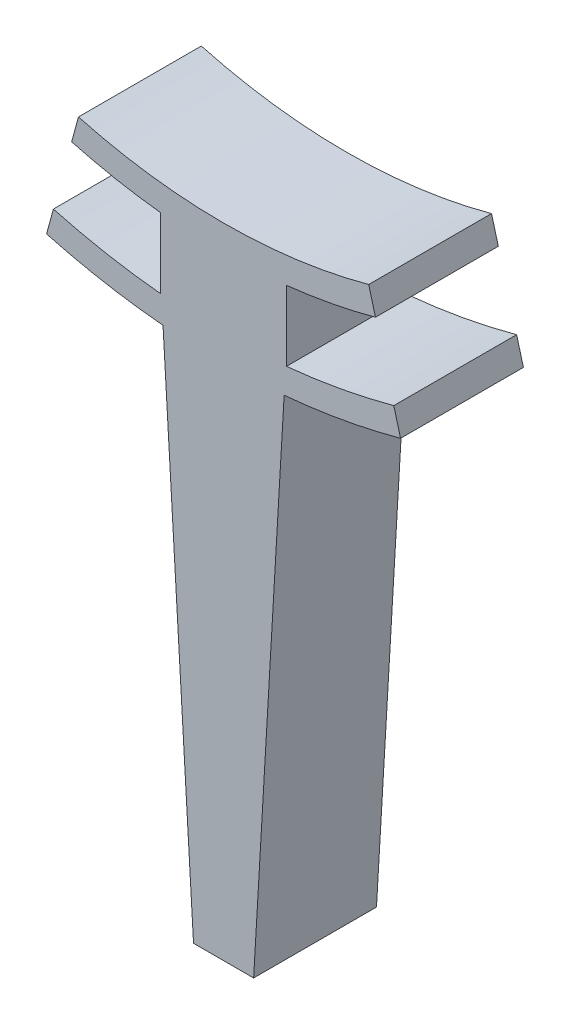
ISO-10303-21;
HEADER;
FILE_DESCRIPTION(('STEP AP214'),'2;1');
FILE_NAME('part.step','',(''),(''),'','','');
FILE_SCHEMA(('AUTOMOTIVE_DESIGN { 1 0 10303 214 1 1 1 1 }'));
ENDSEC;
DATA;
#1=APPLICATION_CONTEXT('core data for automotive mechanical design processes');
#2=APPLICATION_PROTOCOL_DEFINITION('international standard','automotive_design',2000,#1);
#3=PRODUCT_CONTEXT('',#1,'mechanical');
#4=PRODUCT('Part','Part','',(#3));
#5=PRODUCT_RELATED_PRODUCT_CATEGORY('part','',(#4));
#6=PRODUCT_DEFINITION_FORMATION('','',#4);
#7=PRODUCT_DEFINITION_CONTEXT('part definition',#1,'design');
#8=PRODUCT_DEFINITION('design','',#6,#7);
#9=PRODUCT_DEFINITION_SHAPE('','',#8);
#10=(LENGTH_UNIT() NAMED_UNIT(*) SI_UNIT(.MILLI.,.METRE.));
#11=(NAMED_UNIT(*) PLANE_ANGLE_UNIT() SI_UNIT($,.RADIAN.));
#12=(NAMED_UNIT(*) SI_UNIT($,.STERADIAN.) SOLID_ANGLE_UNIT());
#13=UNCERTAINTY_MEASURE_WITH_UNIT(LENGTH_MEASURE(1.E-05),#10,'distance_accuracy_value','');
#14=(GEOMETRIC_REPRESENTATION_CONTEXT(3) GLOBAL_UNCERTAINTY_ASSIGNED_CONTEXT((#13)) GLOBAL_UNIT_ASSIGNED_CONTEXT((#10,
#11,#12)) REPRESENTATION_CONTEXT('',''));
#15=CARTESIAN_POINT('',(0.,0.,0.));
#16=DIRECTION('',(0.,0.,1.));
#17=DIRECTION('',(1.,0.,0.));
#18=AXIS2_PLACEMENT_3D('',#15,#16,#17);
#19=CARTESIAN_POINT('',(-0.300000000011735,16.8600000000012,-9.5));
#20=DIRECTION('',(0.,0.,1.));
#21=DIRECTION('',(1.,0.,0.));
#22=AXIS2_PLACEMENT_3D('',#19,#20,#21);
#23=CYLINDRICAL_SURFACE('',#22,50.2000000000121);
#24=CARTESIAN_POINT('',(-0.300000000011735,16.8600000000012,0.));
#25=DIRECTION('',(0.,0.,1.));
#26=DIRECTION('',(1.,0.,0.));
#27=AXIS2_PLACEMENT_3D('',#24,#25,#26);
#28=CIRCLE('',#27,50.2000000000121);
#29=CARTESIAN_POINT('',(-13.4635226209664,-31.5833862586908,0.));
#30=VERTEX_POINT('',#29);
#31=CARTESIAN_POINT('',(-5.16515575527619,-33.1036894101918,0.));
#32=VERTEX_POINT('',#31);
#33=EDGE_CURVE('E181',#30,#32,#28,.T.);
#34=ORIENTED_EDGE('',*,*,#33,.T.);
#35=DIRECTION('',(0.,0.,1.));
#36=VECTOR('',#35,1.);
#37=CARTESIAN_POINT('',(-5.16515575527619,-33.1036894101918,-9.5));
#38=LINE('',#37,#36);
#39=CARTESIAN_POINT('',(-5.16515575527619,-33.1036894101918,-9.5));
#40=VERTEX_POINT('',#39);
#41=EDGE_CURVE('E11',#40,#32,#38,.T.);
#42=ORIENTED_EDGE('',*,*,#41,.F.);
#43=CARTESIAN_POINT('',(-0.300000000011735,16.8600000000012,-9.5));
#44=DIRECTION('',(0.,0.,1.));
#45=DIRECTION('',(1.,0.,0.));
#46=AXIS2_PLACEMENT_3D('',#43,#44,#45);
#47=CIRCLE('',#46,50.2000000000121);
#48=CARTESIAN_POINT('',(-13.4635226209664,-31.5833862586908,-9.5));
#49=VERTEX_POINT('',#48);
#50=EDGE_CURVE('E118',#49,#40,#47,.T.);
#51=ORIENTED_EDGE('',*,*,#50,.F.);
#52=DIRECTION('',(0.,0.,1.));
#53=VECTOR('',#52,1.);
#54=CARTESIAN_POINT('',(-13.4635226209664,-31.5833862586908,-9.5));
#55=LINE('',#54,#53);
#56=EDGE_CURVE('E54',#49,#30,#55,.T.);
#57=ORIENTED_EDGE('',*,*,#56,.T.);
#58=EDGE_LOOP('',(#34,#42,#51,#57));
#59=FACE_BOUND('',#58,.T.);
#60=ADVANCED_FACE('F39',(#59),#23,.F.);
#61=CARTESIAN_POINT('',(-5.16515575527619,-27.6750452955403,-9.5));
#62=DIRECTION('',(-1.,0.,0.));
#63=DIRECTION('',(0.,0.,1.));
#64=AXIS2_PLACEMENT_3D('',#61,#62,#63);
#65=PLANE('',#64);
#66=DIRECTION('',(0.,-1.,0.));
#67=VECTOR('',#66,1.);
#68=CARTESIAN_POINT('',(-5.16515575527619,-27.6750452955403,0.));
#69=LINE('',#68,#67);
#70=CARTESIAN_POINT('',(-5.16515575527621,-27.6750452955403,0.));
#71=VERTEX_POINT('',#70);
#72=EDGE_CURVE('E183',#71,#32,#69,.T.);
#73=ORIENTED_EDGE('',*,*,#72,.F.);
#74=DIRECTION('',(0.,0.,1.));
#75=VECTOR('',#74,1.);
#76=CARTESIAN_POINT('',(-5.16515575527621,-27.6750452955403,-9.5));
#77=LINE('',#76,#75);
#78=CARTESIAN_POINT('',(-5.16515575527621,-27.6750452955403,-9.5));
#79=VERTEX_POINT('',#78);
#80=EDGE_CURVE('E50',#79,#71,#77,.T.);
#81=ORIENTED_EDGE('',*,*,#80,.F.);
#82=DIRECTION('',(0.,-1.,0.));
#83=VECTOR('',#82,1.);
#84=CARTESIAN_POINT('',(-5.16515575527619,-27.6750452955403,-9.5));
#85=LINE('',#84,#83);
#86=EDGE_CURVE('E311',#79,#40,#85,.T.);
#87=ORIENTED_EDGE('',*,*,#86,.T.);
#88=ORIENTED_EDGE('',*,*,#41,.T.);
#89=EDGE_LOOP('',(#73,#81,#87,#88));
#90=FACE_BOUND('',#89,.T.);
#91=ADVANCED_FACE('F258',(#90),#65,.T.);
#92=CARTESIAN_POINT('',(-0.300000000011735,16.8600000000012,-9.5));
#93=DIRECTION('',(0.,0.,1.));
#94=DIRECTION('',(1.,0.,0.));
#95=AXIS2_PLACEMENT_3D('',#92,#93,#94);
#96=CYLINDRICAL_SURFACE('',#95,44.7999999999879);
#97=CARTESIAN_POINT('',(-0.300000000011735,16.8600000000012,0.));
#98=DIRECTION('',(0.,0.,1.));
#99=DIRECTION('',(1.,0.,0.));
#100=AXIS2_PLACEMENT_3D('',#97,#98,#99);
#101=CIRCLE('',#100,44.7999999999879);
#102=CARTESIAN_POINT('',(-12.0475261637263,-26.3723447089289,0.));
#103=VERTEX_POINT('',#102);
#104=EDGE_CURVE('E186',#103,#71,#101,.T.);
#105=ORIENTED_EDGE('',*,*,#104,.F.);
#106=DIRECTION('',(0.,0.,1.));
#107=VECTOR('',#106,1.);
#108=CARTESIAN_POINT('',(-12.0475261637263,-26.3723447089289,-9.5));
#109=LINE('',#108,#107);
#110=CARTESIAN_POINT('',(-12.0475261637263,-26.3723447089289,-9.5));
#111=VERTEX_POINT('',#110);
#112=EDGE_CURVE('E247',#111,#103,#109,.T.);
#113=ORIENTED_EDGE('',*,*,#112,.F.);
#114=CARTESIAN_POINT('',(-0.300000000011735,16.8600000000012,-9.5));
#115=DIRECTION('',(0.,0.,1.));
#116=DIRECTION('',(1.,0.,0.));
#117=AXIS2_PLACEMENT_3D('',#114,#115,#116);
#118=CIRCLE('',#117,44.7999999999879);
#119=EDGE_CURVE('E251',#111,#79,#118,.T.);
#120=ORIENTED_EDGE('',*,*,#119,.T.);
#121=ORIENTED_EDGE('',*,*,#80,.T.);
#122=EDGE_LOOP('',(#105,#113,#120,#121));
#123=FACE_BOUND('',#122,.T.);
#124=ADVANCED_FACE('F253',(#123),#96,.T.);
#125=CARTESIAN_POINT('',(-12.0475261637263,-26.3723447089289,-9.5));
#126=DIRECTION('',(0.965007694396022,-0.262221566154413,0.));
#127=DIRECTION('',(0.262221566154413,0.965007694396022,0.));
#128=AXIS2_PLACEMENT_3D('',#125,#126,#127);
#129=PLANE('',#128);
#130=DIRECTION('',(0.262221566154413,0.965007694396022,0.));
#131=VECTOR('',#130,1.);
#132=CARTESIAN_POINT('',(-12.0475261637263,-26.3723447089289,0.));
#133=LINE('',#132,#131);
#134=CARTESIAN_POINT('',(-11.5230830314174,-24.4423293201369,0.));
#135=VERTEX_POINT('',#134);
#136=EDGE_CURVE('E188',#103,#135,#133,.T.);
#137=ORIENTED_EDGE('',*,*,#136,.T.);
#138=DIRECTION('',(0.,0.,1.));
#139=VECTOR('',#138,1.);
#140=CARTESIAN_POINT('',(-11.5230830314174,-24.4423293201369,-9.5));
#141=LINE('',#140,#139);
#142=CARTESIAN_POINT('',(-11.5230830314174,-24.4423293201369,-9.5));
#143=VERTEX_POINT('',#142);
#144=EDGE_CURVE('E241',#143,#135,#141,.T.);
#145=ORIENTED_EDGE('',*,*,#144,.F.);
#146=DIRECTION('',(0.262221566154413,0.965007694396022,0.));
#147=VECTOR('',#146,1.);
#148=CARTESIAN_POINT('',(-12.0475261637263,-26.3723447089289,-9.5));
#149=LINE('',#148,#147);
#150=EDGE_CURVE('E273',#111,#143,#149,.T.);
#151=ORIENTED_EDGE('',*,*,#150,.F.);
#152=ORIENTED_EDGE('',*,*,#112,.T.);
#153=EDGE_LOOP('',(#137,#145,#151,#152));
#154=FACE_BOUND('',#153,.T.);
#155=ADVANCED_FACE('F261',(#154),#129,.F.);
#156=CARTESIAN_POINT('',(-0.300000000011735,16.8600000000012,-9.5));
#157=DIRECTION('',(0.,0.,1.));
#158=DIRECTION('',(1.,0.,0.));
#159=AXIS2_PLACEMENT_3D('',#156,#157,#158);
#160=CYLINDRICAL_SURFACE('',#159,42.7999999999879);
#161=CARTESIAN_POINT('',(-0.300000000011735,16.8600000000012,0.));
#162=DIRECTION('',(0.,0.,1.));
#163=DIRECTION('',(1.,0.,0.));
#164=AXIS2_PLACEMENT_3D('',#161,#162,#163);
#165=CIRCLE('',#164,42.7999999999879);
#166=CARTESIAN_POINT('',(10.923083031394,-24.4423293201368,0.));
#167=VERTEX_POINT('',#166);
#168=EDGE_CURVE('E192',#135,#167,#165,.T.);
#169=ORIENTED_EDGE('',*,*,#168,.T.);
#170=DIRECTION('',(0.,0.,1.));
#171=VECTOR('',#170,1.);
#172=CARTESIAN_POINT('',(10.923083031394,-24.4423293201368,-9.5));
#173=LINE('',#172,#171);
#174=CARTESIAN_POINT('',(10.923083031394,-24.4423293201368,-9.5));
#175=VERTEX_POINT('',#174);
#176=EDGE_CURVE('E243',#175,#167,#173,.T.);
#177=ORIENTED_EDGE('',*,*,#176,.F.);
#178=CARTESIAN_POINT('',(-0.300000000011735,16.8600000000012,-9.5));
#179=DIRECTION('',(0.,0.,1.));
#180=DIRECTION('',(1.,0.,0.));
#181=AXIS2_PLACEMENT_3D('',#178,#179,#180);
#182=CIRCLE('',#181,42.7999999999879);
#183=EDGE_CURVE('E267',#143,#175,#182,.T.);
#184=ORIENTED_EDGE('',*,*,#183,.F.);
#185=ORIENTED_EDGE('',*,*,#144,.T.);
#186=EDGE_LOOP('',(#169,#177,#184,#185));
#187=FACE_BOUND('',#186,.T.);
#188=ADVANCED_FACE('F270',(#187),#160,.F.);
#189=CARTESIAN_POINT('',(11.4475261637028,-26.3723447089289,-9.5));
#190=DIRECTION('',(0.965007694396022,0.262221566154413,0.));
#191=DIRECTION('',(-0.262221566154413,0.965007694396022,0.));
#192=AXIS2_PLACEMENT_3D('',#189,#190,#191);
#193=PLANE('',#192);
#194=DIRECTION('',(-0.262221566154413,0.965007694396022,0.));
#195=VECTOR('',#194,1.);
#196=CARTESIAN_POINT('',(11.4475261637028,-26.3723447089289,0.));
#197=LINE('',#196,#195);
#198=CARTESIAN_POINT('',(11.4475261637028,-26.3723447089289,0.));
#199=VERTEX_POINT('',#198);
#200=EDGE_CURVE('E191',#199,#167,#197,.T.);
#201=ORIENTED_EDGE('',*,*,#200,.F.);
#202=DIRECTION('',(0.,0.,1.));
#203=VECTOR('',#202,1.);
#204=CARTESIAN_POINT('',(11.4475261637028,-26.3723447089289,-9.5));
#205=LINE('',#204,#203);
#206=CARTESIAN_POINT('',(11.4475261637028,-26.3723447089289,-9.5));
#207=VERTEX_POINT('',#206);
#208=EDGE_CURVE('E236',#207,#199,#205,.T.);
#209=ORIENTED_EDGE('',*,*,#208,.F.);
#210=DIRECTION('',(-0.262221566154413,0.965007694396022,0.));
#211=VECTOR('',#210,1.);
#212=CARTESIAN_POINT('',(11.4475261637028,-26.3723447089289,-9.5));
#213=LINE('',#212,#211);
#214=EDGE_CURVE('E275',#207,#175,#213,.T.);
#215=ORIENTED_EDGE('',*,*,#214,.T.);
#216=ORIENTED_EDGE('',*,*,#176,.T.);
#217=EDGE_LOOP('',(#201,#209,#215,#216));
#218=FACE_BOUND('',#217,.T.);
#219=ADVANCED_FACE('F322',(#218),#193,.T.);
#220=CARTESIAN_POINT('',(-0.300000000011735,16.8600000000012,-9.5));
#221=DIRECTION('',(0.,0.,1.));
#222=DIRECTION('',(1.,0.,0.));
#223=AXIS2_PLACEMENT_3D('',#220,#221,#222);
#224=CYLINDRICAL_SURFACE('',#223,44.7999999999879);
#225=CARTESIAN_POINT('',(-0.300000000011735,16.8600000000012,0.));
#226=DIRECTION('',(0.,0.,1.));
#227=DIRECTION('',(1.,0.,0.));
#228=AXIS2_PLACEMENT_3D('',#225,#226,#227);
#229=CIRCLE('',#228,44.7999999999879);
#230=CARTESIAN_POINT('',(4.56515575525271,-27.6750452955403,0.));
#231=VERTEX_POINT('',#230);
#232=EDGE_CURVE('E200',#231,#199,#229,.T.);
#233=ORIENTED_EDGE('',*,*,#232,.F.);
#234=DIRECTION('',(0.,0.,1.));
#235=VECTOR('',#234,1.);
#236=CARTESIAN_POINT('',(4.56515575525271,-27.6750452955403,-9.5));
#237=LINE('',#236,#235);
#238=CARTESIAN_POINT('',(4.56515575525271,-27.6750452955403,-9.5));
#239=VERTEX_POINT('',#238);
#240=EDGE_CURVE('E240',#239,#231,#237,.T.);
#241=ORIENTED_EDGE('',*,*,#240,.F.);
#242=CARTESIAN_POINT('',(-0.300000000011735,16.8600000000012,-9.5));
#243=DIRECTION('',(0.,0.,1.));
#244=DIRECTION('',(1.,0.,0.));
#245=AXIS2_PLACEMENT_3D('',#242,#243,#244);
#246=CIRCLE('',#245,44.7999999999879);
#247=EDGE_CURVE('E274',#239,#207,#246,.T.);
#248=ORIENTED_EDGE('',*,*,#247,.T.);
#249=ORIENTED_EDGE('',*,*,#208,.T.);
#250=EDGE_LOOP('',(#233,#241,#248,#249));
#251=FACE_BOUND('',#250,.T.);
#252=ADVANCED_FACE('F327',(#251),#224,.T.);
#253=CARTESIAN_POINT('',(4.56515575525271,-27.6750452955403,-9.5));
#254=DIRECTION('',(-1.,0.,0.));
#255=DIRECTION('',(0.,-1.,0.));
#256=AXIS2_PLACEMENT_3D('',#253,#254,#255);
#257=PLANE('',#256);
#258=DIRECTION('',(0.,-1.,0.));
#259=VECTOR('',#258,1.);
#260=CARTESIAN_POINT('',(4.56515575525271,-27.6750452955403,0.));
#261=LINE('',#260,#259);
#262=CARTESIAN_POINT('',(4.56515575525269,-33.1036894101918,0.));
#263=VERTEX_POINT('',#262);
#264=EDGE_CURVE('E199',#231,#263,#261,.T.);
#265=ORIENTED_EDGE('',*,*,#264,.T.);
#266=DIRECTION('',(0.,0.,1.));
#267=VECTOR('',#266,1.);
#268=CARTESIAN_POINT('',(4.56515575525269,-33.1036894101918,-9.5));
#269=LINE('',#268,#267);
#270=CARTESIAN_POINT('',(4.56515575525269,-33.1036894101918,-9.5));
#271=VERTEX_POINT('',#270);
#272=EDGE_CURVE('E233',#271,#263,#269,.T.);
#273=ORIENTED_EDGE('',*,*,#272,.F.);
#274=DIRECTION('',(0.,-1.,0.));
#275=VECTOR('',#274,1.);
#276=CARTESIAN_POINT('',(4.56515575525271,-27.6750452955403,-9.5));
#277=LINE('',#276,#275);
#278=EDGE_CURVE('E285',#239,#271,#277,.T.);
#279=ORIENTED_EDGE('',*,*,#278,.F.);
#280=ORIENTED_EDGE('',*,*,#240,.T.);
#281=EDGE_LOOP('',(#265,#273,#279,#280));
#282=FACE_BOUND('',#281,.T.);
#283=ADVANCED_FACE('F328',(#282),#257,.F.);
#284=CARTESIAN_POINT('',(-0.300000000011735,16.8600000000012,-9.5));
#285=DIRECTION('',(0.,0.,1.));
#286=DIRECTION('',(1.,0.,0.));
#287=AXIS2_PLACEMENT_3D('',#284,#285,#286);
#288=CYLINDRICAL_SURFACE('',#287,50.2000000000121);
#289=CARTESIAN_POINT('',(-0.300000000011735,16.8600000000012,0.));
#290=DIRECTION('',(0.,0.,1.));
#291=DIRECTION('',(1.,0.,0.));
#292=AXIS2_PLACEMENT_3D('',#289,#290,#291);
#293=CIRCLE('',#292,50.2000000000121);
#294=CARTESIAN_POINT('',(12.863522620943,-31.5833862586908,0.));
#295=VERTEX_POINT('',#294);
#296=EDGE_CURVE('E205',#263,#295,#293,.T.);
#297=ORIENTED_EDGE('',*,*,#296,.T.);
#298=DIRECTION('',(0.,0.,1.));
#299=VECTOR('',#298,1.);
#300=CARTESIAN_POINT('',(12.863522620943,-31.5833862586908,-9.5));
#301=LINE('',#300,#299);
#302=CARTESIAN_POINT('',(12.863522620943,-31.5833862586908,-9.5));
#303=VERTEX_POINT('',#302);
#304=EDGE_CURVE('E231',#303,#295,#301,.T.);
#305=ORIENTED_EDGE('',*,*,#304,.F.);
#306=CARTESIAN_POINT('',(-0.300000000011735,16.8600000000012,-9.5));
#307=DIRECTION('',(0.,0.,1.));
#308=DIRECTION('',(1.,0.,0.));
#309=AXIS2_PLACEMENT_3D('',#306,#307,#308);
#310=CIRCLE('',#309,50.2000000000121);
#311=EDGE_CURVE('E281',#271,#303,#310,.T.);
#312=ORIENTED_EDGE('',*,*,#311,.F.);
#313=ORIENTED_EDGE('',*,*,#272,.T.);
#314=EDGE_LOOP('',(#297,#305,#312,#313));
#315=FACE_BOUND('',#314,.T.);
#316=ADVANCED_FACE('F332',(#315),#288,.F.);
#317=CARTESIAN_POINT('',(12.863522620943,-31.5833862586908,-9.5));
#318=DIRECTION('',(-0.965007694396022,-0.262221566154413,0.));
#319=DIRECTION('',(0.262221566154413,-0.965007694396022,0.));
#320=AXIS2_PLACEMENT_3D('',#317,#318,#319);
#321=PLANE('',#320);
#322=DIRECTION('',(0.262221566154413,-0.965007694396022,0.));
#323=VECTOR('',#322,1.);
#324=CARTESIAN_POINT('',(12.863522620943,-31.5833862586908,0.));
#325=LINE('',#324,#323);
#326=CARTESIAN_POINT('',(13.3879657532518,-33.5134016474829,0.));
#327=VERTEX_POINT('',#326);
#328=EDGE_CURVE('E204',#295,#327,#325,.T.);
#329=ORIENTED_EDGE('',*,*,#328,.T.);
#330=DIRECTION('',(0.,0.,1.));
#331=VECTOR('',#330,1.);
#332=CARTESIAN_POINT('',(13.3879657532518,-33.5134016474829,-9.5));
#333=LINE('',#332,#331);
#334=CARTESIAN_POINT('',(13.3879657532518,-33.5134016474829,-9.5));
#335=VERTEX_POINT('',#334);
#336=EDGE_CURVE('E227',#335,#327,#333,.T.);
#337=ORIENTED_EDGE('',*,*,#336,.F.);
#338=DIRECTION('',(0.262221566154413,-0.965007694396022,0.));
#339=VECTOR('',#338,1.);
#340=CARTESIAN_POINT('',(12.863522620943,-31.5833862586908,-9.5));
#341=LINE('',#340,#339);
#342=EDGE_CURVE('E288',#303,#335,#341,.T.);
#343=ORIENTED_EDGE('',*,*,#342,.F.);
#344=ORIENTED_EDGE('',*,*,#304,.T.);
#345=EDGE_LOOP('',(#329,#337,#343,#344));
#346=FACE_BOUND('',#345,.T.);
#347=ADVANCED_FACE('F336',(#346),#321,.F.);
#348=CARTESIAN_POINT('',(-0.300000000011735,16.8600000000012,-9.5));
#349=DIRECTION('',(0.,0.,1.));
#350=DIRECTION('',(1.,0.,0.));
#351=AXIS2_PLACEMENT_3D('',#348,#349,#350);
#352=CYLINDRICAL_SURFACE('',#351,52.2000000000121);
#353=CARTESIAN_POINT('',(-0.300000000011735,16.8600000000012,0.));
#354=DIRECTION('',(0.,0.,1.));
#355=DIRECTION('',(1.,0.,0.));
#356=AXIS2_PLACEMENT_3D('',#353,#354,#355);
#357=CIRCLE('',#356,52.2000000000121);
#358=CARTESIAN_POINT('',(4.38362530936764,-35.12945714241,0.));
#359=VERTEX_POINT('',#358);
#360=EDGE_CURVE('E210',#359,#327,#357,.T.);
#361=ORIENTED_EDGE('',*,*,#360,.F.);
#362=DIRECTION('',(0.,0.,1.));
#363=VECTOR('',#362,1.);
#364=CARTESIAN_POINT('',(4.38362530936764,-35.12945714241,-9.5));
#365=LINE('',#364,#363);
#366=CARTESIAN_POINT('',(4.38362530936764,-35.12945714241,-9.5));
#367=VERTEX_POINT('',#366);
#368=EDGE_CURVE('E230',#367,#359,#365,.T.);
#369=ORIENTED_EDGE('',*,*,#368,.F.);
#370=CARTESIAN_POINT('',(-0.300000000011735,16.8600000000012,-9.5));
#371=DIRECTION('',(0.,0.,1.));
#372=DIRECTION('',(1.,0.,0.));
#373=AXIS2_PLACEMENT_3D('',#370,#371,#372);
#374=CIRCLE('',#373,52.2000000000121);
#375=EDGE_CURVE('E286',#367,#335,#374,.T.);
#376=ORIENTED_EDGE('',*,*,#375,.T.);
#377=ORIENTED_EDGE('',*,*,#336,.T.);
#378=EDGE_LOOP('',(#361,#369,#376,#377));
#379=FACE_BOUND('',#378,.T.);
#380=ADVANCED_FACE('F345',(#379),#352,.T.);
#381=CARTESIAN_POINT('',(4.38362530936764,-35.12945714241,-9.5));
#382=DIRECTION('',(-0.998283261595363,0.0585707232200894,0.));
#383=DIRECTION('',(-0.0585707232200894,-0.998283261595363,0.));
#384=AXIS2_PLACEMENT_3D('',#381,#382,#383);
#385=PLANE('',#384);
#386=DIRECTION('',(-0.0585707232200894,-0.998283261595363,0.));
#387=VECTOR('',#386,1.);
#388=CARTESIAN_POINT('',(4.38362530936764,-35.12945714241,0.));
#389=LINE('',#388,#387);
#390=CARTESIAN_POINT('',(2.02441458547121,-75.3400000000109,0.));
#391=VERTEX_POINT('',#390);
#392=EDGE_CURVE('E209',#359,#391,#389,.T.);
#393=ORIENTED_EDGE('',*,*,#392,.T.);
#394=DIRECTION('',(0.,0.,1.));
#395=VECTOR('',#394,1.);
#396=CARTESIAN_POINT('',(2.02441458547121,-75.3400000000109,-9.5));
#397=LINE('',#396,#395);
#398=CARTESIAN_POINT('',(2.02441458547121,-75.3400000000109,-9.5));
#399=VERTEX_POINT('',#398);
#400=EDGE_CURVE('E224',#399,#391,#397,.T.);
#401=ORIENTED_EDGE('',*,*,#400,.F.);
#402=DIRECTION('',(-0.0585707232200894,-0.998283261595363,0.));
#403=VECTOR('',#402,1.);
#404=CARTESIAN_POINT('',(4.38362530936764,-35.12945714241,-9.5));
#405=LINE('',#404,#403);
#406=EDGE_CURVE('E292',#367,#399,#405,.T.);
#407=ORIENTED_EDGE('',*,*,#406,.F.);
#408=ORIENTED_EDGE('',*,*,#368,.T.);
#409=EDGE_LOOP('',(#393,#401,#407,#408));
#410=FACE_BOUND('',#409,.T.);
#411=ADVANCED_FACE('F348',(#410),#385,.F.);
#412=CARTESIAN_POINT('',(-2.62441458549467,-75.3400000000109,-9.5));
#413=DIRECTION('',(0.,-1.,0.));
#414=DIRECTION('',(0.,0.,-1.));
#415=AXIS2_PLACEMENT_3D('',#412,#413,#414);
#416=PLANE('',#415);
#417=DIRECTION('',(1.,0.,0.));
#418=VECTOR('',#417,1.);
#419=CARTESIAN_POINT('',(-2.62441458549467,-75.3400000000109,0.));
#420=LINE('',#419,#418);
#421=CARTESIAN_POINT('',(-2.62441458549467,-75.3400000000109,0.));
#422=VERTEX_POINT('',#421);
#423=EDGE_CURVE('E211',#422,#391,#420,.T.);
#424=ORIENTED_EDGE('',*,*,#423,.F.);
#425=DIRECTION('',(0.,0.,1.));
#426=VECTOR('',#425,1.);
#427=CARTESIAN_POINT('',(-2.62441458549467,-75.3400000000109,-9.5));
#428=LINE('',#427,#426);
#429=CARTESIAN_POINT('',(-2.62441458549467,-75.3400000000109,-9.5));
#430=VERTEX_POINT('',#429);
#431=EDGE_CURVE('E168',#430,#422,#428,.T.);
#432=ORIENTED_EDGE('',*,*,#431,.F.);
#433=DIRECTION('',(1.,0.,0.));
#434=VECTOR('',#433,1.);
#435=CARTESIAN_POINT('',(-2.62441458549467,-75.3400000000109,-9.5));
#436=LINE('',#435,#434);
#437=EDGE_CURVE('E171',#430,#399,#436,.T.);
#438=ORIENTED_EDGE('',*,*,#437,.T.);
#439=ORIENTED_EDGE('',*,*,#400,.T.);
#440=EDGE_LOOP('',(#424,#432,#438,#439));
#441=FACE_BOUND('',#440,.T.);
#442=ADVANCED_FACE('F294',(#441),#416,.T.);
#443=CARTESIAN_POINT('',(-4.98362530939111,-35.12945714241,-9.5));
#444=DIRECTION('',(-0.998283261595363,-0.0585707232200896,0.));
#445=DIRECTION('',(0.0585707232200896,-0.998283261595363,0.));
#446=AXIS2_PLACEMENT_3D('',#443,#444,#445);
#447=PLANE('',#446);
#448=DIRECTION('',(0.0585707232200896,-0.998283261595363,0.));
#449=VECTOR('',#448,1.);
#450=CARTESIAN_POINT('',(-4.98362530939111,-35.12945714241,0.));
#451=LINE('',#450,#449);
#452=CARTESIAN_POINT('',(-4.98362530939115,-35.12945714241,0.));
#453=VERTEX_POINT('',#452);
#454=EDGE_CURVE('E165',#453,#422,#451,.T.);
#455=ORIENTED_EDGE('',*,*,#454,.F.);
#456=DIRECTION('',(0.,0.,1.));
#457=VECTOR('',#456,1.);
#458=CARTESIAN_POINT('',(-4.98362530939115,-35.12945714241,-9.5));
#459=LINE('',#458,#457);
#460=CARTESIAN_POINT('',(-4.98362530939115,-35.12945714241,-9.5));
#461=VERTEX_POINT('',#460);
#462=EDGE_CURVE('E160',#461,#453,#459,.T.);
#463=ORIENTED_EDGE('',*,*,#462,.F.);
#464=DIRECTION('',(0.0585707232200896,-0.998283261595363,0.));
#465=VECTOR('',#464,1.);
#466=CARTESIAN_POINT('',(-4.98362530939111,-35.12945714241,-9.5));
#467=LINE('',#466,#465);
#468=EDGE_CURVE('E158',#461,#430,#467,.T.);
#469=ORIENTED_EDGE('',*,*,#468,.T.);
#470=ORIENTED_EDGE('',*,*,#431,.T.);
#471=EDGE_LOOP('',(#455,#463,#469,#470));
#472=FACE_BOUND('',#471,.T.);
#473=ADVANCED_FACE('F159',(#472),#447,.T.);
#474=CARTESIAN_POINT('',(-0.300000000011735,16.8600000000012,-9.5));
#475=DIRECTION('',(0.,0.,1.));
#476=DIRECTION('',(1.,0.,0.));
#477=AXIS2_PLACEMENT_3D('',#474,#475,#476);
#478=CYLINDRICAL_SURFACE('',#477,52.2000000000121);
#479=CARTESIAN_POINT('',(-0.300000000011735,16.8600000000012,0.));
#480=DIRECTION('',(0.,0.,1.));
#481=DIRECTION('',(1.,0.,0.));
#482=AXIS2_PLACEMENT_3D('',#479,#480,#481);
#483=CIRCLE('',#482,52.2000000000121);
#484=CARTESIAN_POINT('',(-13.9879657532753,-33.5134016474829,0.));
#485=VERTEX_POINT('',#484);
#486=EDGE_CURVE('E220',#485,#453,#483,.T.);
#487=ORIENTED_EDGE('',*,*,#486,.F.);
#488=DIRECTION('',(0.,0.,1.));
#489=VECTOR('',#488,1.);
#490=CARTESIAN_POINT('',(-13.9879657532753,-33.5134016474829,-9.5));
#491=LINE('',#490,#489);
#492=CARTESIAN_POINT('',(-13.9879657532753,-33.5134016474829,-9.5));
#493=VERTEX_POINT('',#492);
#494=EDGE_CURVE('E101',#493,#485,#491,.T.);
#495=ORIENTED_EDGE('',*,*,#494,.F.);
#496=CARTESIAN_POINT('',(-0.300000000011735,16.8600000000012,-9.5));
#497=DIRECTION('',(0.,0.,1.));
#498=DIRECTION('',(1.,0.,0.));
#499=AXIS2_PLACEMENT_3D('',#496,#497,#498);
#500=CIRCLE('',#499,52.2000000000121);
#501=EDGE_CURVE('E173',#493,#461,#500,.T.);
#502=ORIENTED_EDGE('',*,*,#501,.T.);
#503=ORIENTED_EDGE('',*,*,#462,.T.);
#504=EDGE_LOOP('',(#487,#495,#502,#503));
#505=FACE_BOUND('',#504,.T.);
#506=ADVANCED_FACE('F172',(#505),#478,.T.);
#507=CARTESIAN_POINT('',(-13.4635226209664,-31.5833862586908,-9.5));
#508=DIRECTION('',(-0.965007694396022,0.262221566154413,0.));
#509=DIRECTION('',(-0.262221566154413,-0.965007694396022,0.));
#510=AXIS2_PLACEMENT_3D('',#507,#508,#509);
#511=PLANE('',#510);
#512=DIRECTION('',(-0.262221566154413,-0.965007694396022,0.));
#513=VECTOR('',#512,1.);
#514=CARTESIAN_POINT('',(-13.4635226209664,-31.5833862586908,0.));
#515=LINE('',#514,#513);
#516=EDGE_CURVE('E219',#30,#485,#515,.T.);
#517=ORIENTED_EDGE('',*,*,#516,.F.);
#518=ORIENTED_EDGE('',*,*,#56,.F.);
#519=DIRECTION('',(-0.262221566154413,-0.965007694396022,0.));
#520=VECTOR('',#519,1.);
#521=CARTESIAN_POINT('',(-13.4635226209664,-31.5833862586908,-9.5));
#522=LINE('',#521,#520);
#523=EDGE_CURVE('E176',#49,#493,#522,.T.);
#524=ORIENTED_EDGE('',*,*,#523,.T.);
#525=ORIENTED_EDGE('',*,*,#494,.T.);
#526=EDGE_LOOP('',(#517,#518,#524,#525));
#527=FACE_BOUND('',#526,.T.);
#528=ADVANCED_FACE('F300',(#527),#511,.T.);
#529=CARTESIAN_POINT('',(-0.300000000011735,16.8600000000012,-9.5));
#530=DIRECTION('',(0.,0.,1.));
#531=DIRECTION('',(1.,0.,0.));
#532=AXIS2_PLACEMENT_3D('',#529,#530,#531);
#533=PLANE('',#532);
#534=ORIENTED_EDGE('',*,*,#50,.T.);
#535=ORIENTED_EDGE('',*,*,#86,.F.);
#536=ORIENTED_EDGE('',*,*,#119,.F.);
#537=ORIENTED_EDGE('',*,*,#150,.T.);
#538=ORIENTED_EDGE('',*,*,#183,.T.);
#539=ORIENTED_EDGE('',*,*,#214,.F.);
#540=ORIENTED_EDGE('',*,*,#247,.F.);
#541=ORIENTED_EDGE('',*,*,#278,.T.);
#542=ORIENTED_EDGE('',*,*,#311,.T.);
#543=ORIENTED_EDGE('',*,*,#342,.T.);
#544=ORIENTED_EDGE('',*,*,#375,.F.);
#545=ORIENTED_EDGE('',*,*,#406,.T.);
#546=ORIENTED_EDGE('',*,*,#437,.F.);
#547=ORIENTED_EDGE('',*,*,#468,.F.);
#548=ORIENTED_EDGE('',*,*,#501,.F.);
#549=ORIENTED_EDGE('',*,*,#523,.F.);
#550=EDGE_LOOP('',(#534,#535,#536,#537,#538,#539,#540,#541,#542,#543,#544,#545,#546,#547,#548,#549));
#551=FACE_BOUND('',#550,.T.);
#552=ADVANCED_FACE('F169',(#551),#533,.F.);
#553=CARTESIAN_POINT('',(-0.300000000011735,16.8600000000012,0.));
#554=DIRECTION('',(0.,0.,1.));
#555=DIRECTION('',(1.,0.,0.));
#556=AXIS2_PLACEMENT_3D('',#553,#554,#555);
#557=PLANE('',#556);
#558=ORIENTED_EDGE('',*,*,#33,.F.);
#559=ORIENTED_EDGE('',*,*,#516,.T.);
#560=ORIENTED_EDGE('',*,*,#486,.T.);
#561=ORIENTED_EDGE('',*,*,#454,.T.);
#562=ORIENTED_EDGE('',*,*,#423,.T.);
#563=ORIENTED_EDGE('',*,*,#392,.F.);
#564=ORIENTED_EDGE('',*,*,#360,.T.);
#565=ORIENTED_EDGE('',*,*,#328,.F.);
#566=ORIENTED_EDGE('',*,*,#296,.F.);
#567=ORIENTED_EDGE('',*,*,#264,.F.);
#568=ORIENTED_EDGE('',*,*,#232,.T.);
#569=ORIENTED_EDGE('',*,*,#200,.T.);
#570=ORIENTED_EDGE('',*,*,#168,.F.);
#571=ORIENTED_EDGE('',*,*,#136,.F.);
#572=ORIENTED_EDGE('',*,*,#104,.T.);
#573=ORIENTED_EDGE('',*,*,#72,.T.);
#574=EDGE_LOOP('',(#558,#559,#560,#561,#562,#563,#564,#565,#566,#567,#568,#569,#570,#571,#572,#573));
#575=FACE_BOUND('',#574,.T.);
#576=ADVANCED_FACE('F260',(#575),#557,.T.);
#577=CLOSED_SHELL('',(#60,#91,#124,#155,#188,#219,#252,#283,#316,#347,#380,#411,#442,#473,#506,
#528,#552,#576));
#578=MANIFOLD_SOLID_BREP('B2',#577);
#579=ADVANCED_BREP_SHAPE_REPRESENTATION('',(#18,#578),#14);
#580=SHAPE_DEFINITION_REPRESENTATION(#9,#579);
ENDSEC;
END-ISO-10303-21;
